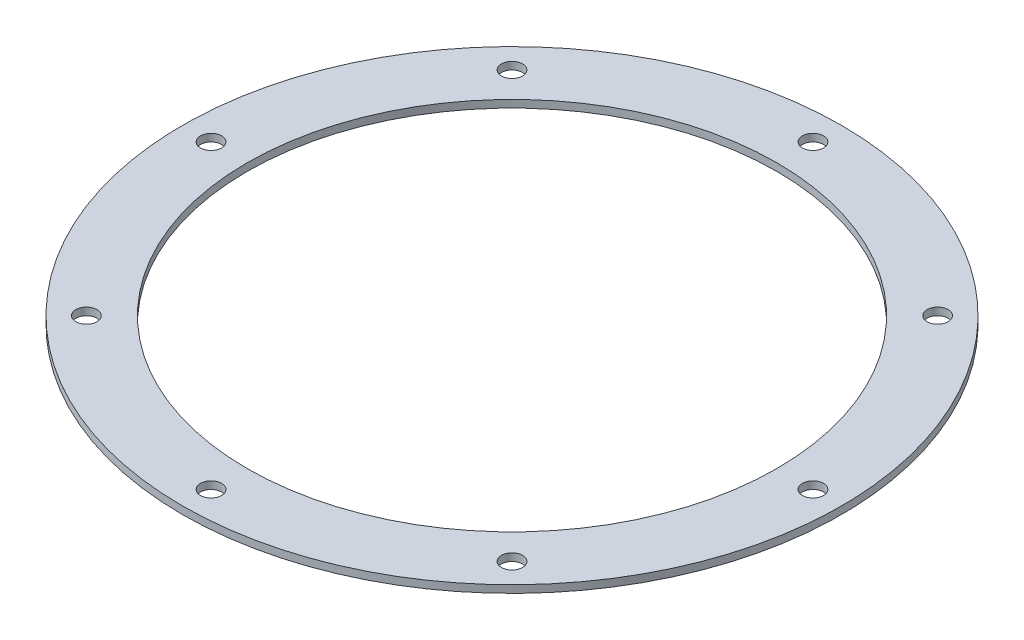
ISO-10303-21;
HEADER;
FILE_DESCRIPTION(('STEP AP214'),'2;1');
FILE_NAME('part.step','',(''),(''),'','','');
FILE_SCHEMA(('AUTOMOTIVE_DESIGN { 1 0 10303 214 1 1 1 1 }'));
ENDSEC;
DATA;
#1=APPLICATION_CONTEXT('core data for automotive mechanical design processes');
#2=APPLICATION_PROTOCOL_DEFINITION('international standard','automotive_design',2000,#1);
#3=PRODUCT_CONTEXT('',#1,'mechanical');
#4=PRODUCT('Part','Part','',(#3));
#5=PRODUCT_RELATED_PRODUCT_CATEGORY('part','',(#4));
#6=PRODUCT_DEFINITION_FORMATION('','',#4);
#7=PRODUCT_DEFINITION_CONTEXT('part definition',#1,'design');
#8=PRODUCT_DEFINITION('design','',#6,#7);
#9=PRODUCT_DEFINITION_SHAPE('','',#8);
#10=(LENGTH_UNIT() NAMED_UNIT(*) SI_UNIT(.MILLI.,.METRE.));
#11=(NAMED_UNIT(*) PLANE_ANGLE_UNIT() SI_UNIT($,.RADIAN.));
#12=(NAMED_UNIT(*) SI_UNIT($,.STERADIAN.) SOLID_ANGLE_UNIT());
#13=UNCERTAINTY_MEASURE_WITH_UNIT(LENGTH_MEASURE(1.E-05),#10,'distance_accuracy_value','');
#14=(GEOMETRIC_REPRESENTATION_CONTEXT(3) GLOBAL_UNCERTAINTY_ASSIGNED_CONTEXT((#13)) GLOBAL_UNIT_ASSIGNED_CONTEXT((#10,
#11,#12)) REPRESENTATION_CONTEXT('',''));
#15=CARTESIAN_POINT('',(0.,0.,0.));
#16=DIRECTION('',(0.,0.,1.));
#17=DIRECTION('',(1.,0.,0.));
#18=AXIS2_PLACEMENT_3D('',#15,#16,#17);
#19=CARTESIAN_POINT('',(0.,2.5,0.));
#20=DIRECTION('',(0.,1.,0.));
#21=DIRECTION('',(0.,0.,1.));
#22=AXIS2_PLACEMENT_3D('',#19,#20,#21);
#23=PLANE('',#22);
#24=CARTESIAN_POINT('',(-199.999999999994,2.5,5.67209541808933E-12));
#25=DIRECTION('',(0.,1.,0.));
#26=DIRECTION('',(0.,0.,1.));
#27=AXIS2_PLACEMENT_3D('',#24,#25,#26);
#28=CIRCLE('',#27,7.00000000000906);
#29=CARTESIAN_POINT('',(-199.999999999994,2.5,7.00000000001474));
#30=VERTEX_POINT('',#29);
#31=EDGE_CURVE('E86',#30,#30,#28,.T.);
#32=ORIENTED_EDGE('',*,*,#31,.F.);
#33=EDGE_LOOP('',(#32));
#34=FACE_BOUND('',#33,.T.);
#35=CARTESIAN_POINT('',(1.12952049642128E-11,2.5,200.));
#36=DIRECTION('',(0.,1.,0.));
#37=DIRECTION('',(0.,0.,1.));
#38=AXIS2_PLACEMENT_3D('',#35,#36,#37);
#39=CIRCLE('',#38,7.00000000001214);
#40=CARTESIAN_POINT('',(1.12952049642128E-11,2.5,207.000000000012));
#41=VERTEX_POINT('',#40);
#42=EDGE_CURVE('E74',#41,#41,#39,.T.);
#43=ORIENTED_EDGE('',*,*,#42,.F.);
#44=EDGE_LOOP('',(#43));
#45=FACE_BOUND('',#44,.T.);
#46=CARTESIAN_POINT('',(200.000000000006,2.5,-5.64760248210638E-12));
#47=DIRECTION('',(0.,1.,0.));
#48=DIRECTION('',(0.,0.,1.));
#49=AXIS2_PLACEMENT_3D('',#46,#47,#48);
#50=CIRCLE('',#49,7.00000000000442);
#51=CARTESIAN_POINT('',(200.000000000006,2.5,6.99999999999877));
#52=VERTEX_POINT('',#51);
#53=EDGE_CURVE('E62',#52,#52,#50,.T.);
#54=ORIENTED_EDGE('',*,*,#53,.F.);
#55=EDGE_LOOP('',(#54));
#56=FACE_BOUND('',#55,.T.);
#57=CARTESIAN_POINT('',(0.,2.5,-200.));
#58=DIRECTION('',(0.,1.,0.));
#59=DIRECTION('',(0.,0.,1.));
#60=AXIS2_PLACEMENT_3D('',#57,#58,#59);
#61=CIRCLE('',#60,7.);
#62=CARTESIAN_POINT('',(0.,2.5,-193.));
#63=VERTEX_POINT('',#62);
#64=EDGE_CURVE('E50',#63,#63,#61,.T.);
#65=ORIENTED_EDGE('',*,*,#64,.F.);
#66=EDGE_LOOP('',(#65));
#67=FACE_BOUND('',#66,.T.);
#68=CARTESIAN_POINT('',(0.,2.5,0.));
#69=DIRECTION('',(0.,1.,0.));
#70=DIRECTION('',(0.,0.,1.));
#71=AXIS2_PLACEMENT_3D('',#68,#69,#70);
#72=CIRCLE('',#71,219.);
#73=CARTESIAN_POINT('',(0.,2.5,219.));
#74=VERTEX_POINT('',#73);
#75=EDGE_CURVE('E10',#74,#74,#72,.T.);
#76=ORIENTED_EDGE('',*,*,#75,.T.);
#77=EDGE_LOOP('',(#76));
#78=FACE_BOUND('',#77,.T.);
#79=CARTESIAN_POINT('',(0.,2.5,0.));
#80=DIRECTION('',(0.,1.,0.));
#81=DIRECTION('',(0.,0.,1.));
#82=AXIS2_PLACEMENT_3D('',#79,#80,#81);
#83=CIRCLE('',#82,176.);
#84=CARTESIAN_POINT('',(0.,2.5,176.));
#85=VERTEX_POINT('',#84);
#86=EDGE_CURVE('E45',#85,#85,#83,.T.);
#87=ORIENTED_EDGE('',*,*,#86,.F.);
#88=EDGE_LOOP('',(#87));
#89=FACE_BOUND('',#88,.T.);
#90=CARTESIAN_POINT('',(141.42135623731,2.5,-141.421356237309));
#91=DIRECTION('',(0.,1.,0.));
#92=DIRECTION('',(0.,0.,1.));
#93=AXIS2_PLACEMENT_3D('',#90,#91,#92);
#94=CIRCLE('',#93,7.);
#95=CARTESIAN_POINT('',(141.42135623731,2.5,-134.421356237309));
#96=VERTEX_POINT('',#95);
#97=EDGE_CURVE('E56',#96,#96,#94,.T.);
#98=ORIENTED_EDGE('',*,*,#97,.F.);
#99=EDGE_LOOP('',(#98));
#100=FACE_BOUND('',#99,.T.);
#101=CARTESIAN_POINT('',(141.421356237319,2.5,141.421356237306));
#102=DIRECTION('',(0.,1.,0.));
#103=DIRECTION('',(0.,0.,1.));
#104=AXIS2_PLACEMENT_3D('',#101,#102,#103);
#105=CIRCLE('',#104,7.00000000000909);
#106=CARTESIAN_POINT('',(141.421356237319,2.5,148.421356237315));
#107=VERTEX_POINT('',#106);
#108=EDGE_CURVE('E68',#107,#107,#105,.T.);
#109=ORIENTED_EDGE('',*,*,#108,.F.);
#110=EDGE_LOOP('',(#109));
#111=FACE_BOUND('',#110,.T.);
#112=CARTESIAN_POINT('',(-141.4213562373,2.5,141.421356237314));
#113=DIRECTION('',(0.,1.,0.));
#114=DIRECTION('',(0.,0.,1.));
#115=AXIS2_PLACEMENT_3D('',#112,#113,#114);
#116=CIRCLE('',#115,7.00000000001208);
#117=CARTESIAN_POINT('',(-141.4213562373,2.5,148.421356237326));
#118=VERTEX_POINT('',#117);
#119=EDGE_CURVE('E80',#118,#118,#116,.T.);
#120=ORIENTED_EDGE('',*,*,#119,.F.);
#121=EDGE_LOOP('',(#120));
#122=FACE_BOUND('',#121,.T.);
#123=CARTESIAN_POINT('',(-141.421356237308,2.5,-141.421356237305));
#124=DIRECTION('',(0.,1.,0.));
#125=DIRECTION('',(0.,0.,1.));
#126=AXIS2_PLACEMENT_3D('',#123,#124,#125);
#127=CIRCLE('',#126,7.0000000000051);
#128=CARTESIAN_POINT('',(-141.421356237308,2.5,-134.4213562373));
#129=VERTEX_POINT('',#128);
#130=EDGE_CURVE('E92',#129,#129,#127,.T.);
#131=ORIENTED_EDGE('',*,*,#130,.F.);
#132=EDGE_LOOP('',(#131));
#133=FACE_BOUND('',#132,.T.);
#134=ADVANCED_FACE('F34',(#34,#45,#56,#67,#78,#89,#100,#111,#122,#133),#23,.T.);
#135=CARTESIAN_POINT('',(0.,-2.5,0.));
#136=DIRECTION('',(0.,1.,0.));
#137=DIRECTION('',(0.,0.,1.));
#138=AXIS2_PLACEMENT_3D('',#135,#136,#137);
#139=PLANE('',#138);
#140=CARTESIAN_POINT('',(0.,-2.5,0.));
#141=DIRECTION('',(0.,1.,0.));
#142=DIRECTION('',(0.,0.,1.));
#143=AXIS2_PLACEMENT_3D('',#140,#141,#142);
#144=CIRCLE('',#143,219.);
#145=CARTESIAN_POINT('',(0.,-2.5,219.));
#146=VERTEX_POINT('',#145);
#147=EDGE_CURVE('E38',#146,#146,#144,.T.);
#148=ORIENTED_EDGE('',*,*,#147,.F.);
#149=EDGE_LOOP('',(#148));
#150=FACE_BOUND('',#149,.T.);
#151=CARTESIAN_POINT('',(0.,-2.5,0.));
#152=DIRECTION('',(0.,1.,0.));
#153=DIRECTION('',(0.,0.,1.));
#154=AXIS2_PLACEMENT_3D('',#151,#152,#153);
#155=CIRCLE('',#154,176.);
#156=CARTESIAN_POINT('',(0.,-2.5,176.));
#157=VERTEX_POINT('',#156);
#158=EDGE_CURVE('E47',#157,#157,#155,.T.);
#159=ORIENTED_EDGE('',*,*,#158,.T.);
#160=EDGE_LOOP('',(#159));
#161=FACE_BOUND('',#160,.T.);
#162=CARTESIAN_POINT('',(0.,-2.5,-200.));
#163=DIRECTION('',(0.,1.,0.));
#164=DIRECTION('',(0.,0.,1.));
#165=AXIS2_PLACEMENT_3D('',#162,#163,#164);
#166=CIRCLE('',#165,7.);
#167=CARTESIAN_POINT('',(0.,-2.5,-193.));
#168=VERTEX_POINT('',#167);
#169=EDGE_CURVE('E53',#168,#168,#166,.T.);
#170=ORIENTED_EDGE('',*,*,#169,.T.);
#171=EDGE_LOOP('',(#170));
#172=FACE_BOUND('',#171,.T.);
#173=CARTESIAN_POINT('',(141.42135623731,-2.5,-141.421356237309));
#174=DIRECTION('',(0.,1.,0.));
#175=DIRECTION('',(0.,0.,1.));
#176=AXIS2_PLACEMENT_3D('',#173,#174,#175);
#177=CIRCLE('',#176,7.);
#178=CARTESIAN_POINT('',(141.42135623731,-2.5,-134.421356237309));
#179=VERTEX_POINT('',#178);
#180=EDGE_CURVE('E59',#179,#179,#177,.T.);
#181=ORIENTED_EDGE('',*,*,#180,.T.);
#182=EDGE_LOOP('',(#181));
#183=FACE_BOUND('',#182,.T.);
#184=CARTESIAN_POINT('',(200.000000000006,-2.5,-5.64760248210638E-12));
#185=DIRECTION('',(0.,1.,0.));
#186=DIRECTION('',(0.,0.,1.));
#187=AXIS2_PLACEMENT_3D('',#184,#185,#186);
#188=CIRCLE('',#187,7.00000000000442);
#189=CARTESIAN_POINT('',(200.000000000006,-2.5,6.99999999999877));
#190=VERTEX_POINT('',#189);
#191=EDGE_CURVE('E65',#190,#190,#188,.T.);
#192=ORIENTED_EDGE('',*,*,#191,.T.);
#193=EDGE_LOOP('',(#192));
#194=FACE_BOUND('',#193,.T.);
#195=CARTESIAN_POINT('',(141.421356237319,-2.5,141.421356237306));
#196=DIRECTION('',(0.,1.,0.));
#197=DIRECTION('',(0.,0.,1.));
#198=AXIS2_PLACEMENT_3D('',#195,#196,#197);
#199=CIRCLE('',#198,7.00000000000909);
#200=CARTESIAN_POINT('',(141.421356237319,-2.5,148.421356237315));
#201=VERTEX_POINT('',#200);
#202=EDGE_CURVE('E71',#201,#201,#199,.T.);
#203=ORIENTED_EDGE('',*,*,#202,.T.);
#204=EDGE_LOOP('',(#203));
#205=FACE_BOUND('',#204,.T.);
#206=CARTESIAN_POINT('',(1.12952049642128E-11,-2.5,200.));
#207=DIRECTION('',(0.,1.,0.));
#208=DIRECTION('',(0.,0.,1.));
#209=AXIS2_PLACEMENT_3D('',#206,#207,#208);
#210=CIRCLE('',#209,7.00000000001214);
#211=CARTESIAN_POINT('',(1.12952049642128E-11,-2.5,207.000000000012));
#212=VERTEX_POINT('',#211);
#213=EDGE_CURVE('E77',#212,#212,#210,.T.);
#214=ORIENTED_EDGE('',*,*,#213,.T.);
#215=EDGE_LOOP('',(#214));
#216=FACE_BOUND('',#215,.T.);
#217=CARTESIAN_POINT('',(-141.4213562373,-2.5,141.421356237314));
#218=DIRECTION('',(0.,1.,0.));
#219=DIRECTION('',(0.,0.,1.));
#220=AXIS2_PLACEMENT_3D('',#217,#218,#219);
#221=CIRCLE('',#220,7.00000000001208);
#222=CARTESIAN_POINT('',(-141.4213562373,-2.5,148.421356237326));
#223=VERTEX_POINT('',#222);
#224=EDGE_CURVE('E83',#223,#223,#221,.T.);
#225=ORIENTED_EDGE('',*,*,#224,.T.);
#226=EDGE_LOOP('',(#225));
#227=FACE_BOUND('',#226,.T.);
#228=CARTESIAN_POINT('',(-199.999999999994,-2.5,5.67209541808933E-12));
#229=DIRECTION('',(0.,1.,0.));
#230=DIRECTION('',(0.,0.,1.));
#231=AXIS2_PLACEMENT_3D('',#228,#229,#230);
#232=CIRCLE('',#231,7.00000000000906);
#233=CARTESIAN_POINT('',(-199.999999999994,-2.5,7.00000000001474));
#234=VERTEX_POINT('',#233);
#235=EDGE_CURVE('E89',#234,#234,#232,.T.);
#236=ORIENTED_EDGE('',*,*,#235,.T.);
#237=EDGE_LOOP('',(#236));
#238=FACE_BOUND('',#237,.T.);
#239=CARTESIAN_POINT('',(-141.421356237308,-2.5,-141.421356237305));
#240=DIRECTION('',(0.,1.,0.));
#241=DIRECTION('',(0.,0.,1.));
#242=AXIS2_PLACEMENT_3D('',#239,#240,#241);
#243=CIRCLE('',#242,7.0000000000051);
#244=CARTESIAN_POINT('',(-141.421356237308,-2.5,-134.4213562373));
#245=VERTEX_POINT('',#244);
#246=EDGE_CURVE('E95',#245,#245,#243,.T.);
#247=ORIENTED_EDGE('',*,*,#246,.T.);
#248=EDGE_LOOP('',(#247));
#249=FACE_BOUND('',#248,.T.);
#250=ADVANCED_FACE('F105',(#150,#161,#172,#183,#194,#205,#216,#227,#238,#249),#139,.F.);
#251=CARTESIAN_POINT('',(0.,2.5,0.));
#252=DIRECTION('',(0.,-1.,0.));
#253=DIRECTION('',(0.,0.,-1.));
#254=AXIS2_PLACEMENT_3D('',#251,#252,#253);
#255=CYLINDRICAL_SURFACE('',#254,219.);
#256=ORIENTED_EDGE('',*,*,#75,.F.);
#257=EDGE_LOOP('',(#256));
#258=FACE_BOUND('',#257,.T.);
#259=ORIENTED_EDGE('',*,*,#147,.T.);
#260=EDGE_LOOP('',(#259));
#261=FACE_BOUND('',#260,.T.);
#262=ADVANCED_FACE('F36',(#258,#261),#255,.T.);
#263=CARTESIAN_POINT('',(0.,2.5,0.));
#264=DIRECTION('',(0.,-1.,0.));
#265=DIRECTION('',(0.,0.,-1.));
#266=AXIS2_PLACEMENT_3D('',#263,#264,#265);
#267=CYLINDRICAL_SURFACE('',#266,176.);
#268=ORIENTED_EDGE('',*,*,#86,.T.);
#269=EDGE_LOOP('',(#268));
#270=FACE_BOUND('',#269,.T.);
#271=ORIENTED_EDGE('',*,*,#158,.F.);
#272=EDGE_LOOP('',(#271));
#273=FACE_BOUND('',#272,.T.);
#274=ADVANCED_FACE('F115',(#270,#273),#267,.F.);
#275=CARTESIAN_POINT('',(0.,2.5,-200.));
#276=DIRECTION('',(0.,-1.,0.));
#277=DIRECTION('',(0.,0.,-1.));
#278=AXIS2_PLACEMENT_3D('',#275,#276,#277);
#279=CYLINDRICAL_SURFACE('',#278,7.);
#280=ORIENTED_EDGE('',*,*,#64,.T.);
#281=EDGE_LOOP('',(#280));
#282=FACE_BOUND('',#281,.T.);
#283=ORIENTED_EDGE('',*,*,#169,.F.);
#284=EDGE_LOOP('',(#283));
#285=FACE_BOUND('',#284,.T.);
#286=ADVANCED_FACE('F118',(#282,#285),#279,.F.);
#287=CARTESIAN_POINT('',(141.42135623731,2.5,-141.421356237309));
#288=DIRECTION('',(0.,-1.,0.));
#289=DIRECTION('',(0.,0.,-1.));
#290=AXIS2_PLACEMENT_3D('',#287,#288,#289);
#291=CYLINDRICAL_SURFACE('',#290,7.);
#292=ORIENTED_EDGE('',*,*,#97,.T.);
#293=EDGE_LOOP('',(#292));
#294=FACE_BOUND('',#293,.T.);
#295=ORIENTED_EDGE('',*,*,#180,.F.);
#296=EDGE_LOOP('',(#295));
#297=FACE_BOUND('',#296,.T.);
#298=ADVANCED_FACE('F122',(#294,#297),#291,.F.);
#299=CARTESIAN_POINT('',(200.000000000006,2.5,-5.64760248210638E-12));
#300=DIRECTION('',(0.,-1.,0.));
#301=DIRECTION('',(0.,0.,-1.));
#302=AXIS2_PLACEMENT_3D('',#299,#300,#301);
#303=CYLINDRICAL_SURFACE('',#302,7.00000000000442);
#304=ORIENTED_EDGE('',*,*,#53,.T.);
#305=EDGE_LOOP('',(#304));
#306=FACE_BOUND('',#305,.T.);
#307=ORIENTED_EDGE('',*,*,#191,.F.);
#308=EDGE_LOOP('',(#307));
#309=FACE_BOUND('',#308,.T.);
#310=ADVANCED_FACE('F126',(#306,#309),#303,.F.);
#311=CARTESIAN_POINT('',(141.421356237319,2.5,141.421356237306));
#312=DIRECTION('',(0.,-1.,0.));
#313=DIRECTION('',(0.,0.,-1.));
#314=AXIS2_PLACEMENT_3D('',#311,#312,#313);
#315=CYLINDRICAL_SURFACE('',#314,7.00000000000909);
#316=ORIENTED_EDGE('',*,*,#108,.T.);
#317=EDGE_LOOP('',(#316));
#318=FACE_BOUND('',#317,.T.);
#319=ORIENTED_EDGE('',*,*,#202,.F.);
#320=EDGE_LOOP('',(#319));
#321=FACE_BOUND('',#320,.T.);
#322=ADVANCED_FACE('F130',(#318,#321),#315,.F.);
#323=CARTESIAN_POINT('',(1.12952049642128E-11,2.5,200.));
#324=DIRECTION('',(0.,-1.,0.));
#325=DIRECTION('',(0.,0.,-1.));
#326=AXIS2_PLACEMENT_3D('',#323,#324,#325);
#327=CYLINDRICAL_SURFACE('',#326,7.00000000001214);
#328=ORIENTED_EDGE('',*,*,#42,.T.);
#329=EDGE_LOOP('',(#328));
#330=FACE_BOUND('',#329,.T.);
#331=ORIENTED_EDGE('',*,*,#213,.F.);
#332=EDGE_LOOP('',(#331));
#333=FACE_BOUND('',#332,.T.);
#334=ADVANCED_FACE('F134',(#330,#333),#327,.F.);
#335=CARTESIAN_POINT('',(-141.4213562373,2.5,141.421356237314));
#336=DIRECTION('',(0.,-1.,0.));
#337=DIRECTION('',(0.,0.,-1.));
#338=AXIS2_PLACEMENT_3D('',#335,#336,#337);
#339=CYLINDRICAL_SURFACE('',#338,7.00000000001208);
#340=ORIENTED_EDGE('',*,*,#119,.T.);
#341=EDGE_LOOP('',(#340));
#342=FACE_BOUND('',#341,.T.);
#343=ORIENTED_EDGE('',*,*,#224,.F.);
#344=EDGE_LOOP('',(#343));
#345=FACE_BOUND('',#344,.T.);
#346=ADVANCED_FACE('F138',(#342,#345),#339,.F.);
#347=CARTESIAN_POINT('',(-199.999999999994,2.5,5.67209541808933E-12));
#348=DIRECTION('',(0.,-1.,0.));
#349=DIRECTION('',(0.,0.,-1.));
#350=AXIS2_PLACEMENT_3D('',#347,#348,#349);
#351=CYLINDRICAL_SURFACE('',#350,7.00000000000906);
#352=ORIENTED_EDGE('',*,*,#31,.T.);
#353=EDGE_LOOP('',(#352));
#354=FACE_BOUND('',#353,.T.);
#355=ORIENTED_EDGE('',*,*,#235,.F.);
#356=EDGE_LOOP('',(#355));
#357=FACE_BOUND('',#356,.T.);
#358=ADVANCED_FACE('F142',(#354,#357),#351,.F.);
#359=CARTESIAN_POINT('',(-141.421356237308,2.5,-141.421356237305));
#360=DIRECTION('',(0.,-1.,0.));
#361=DIRECTION('',(0.,0.,-1.));
#362=AXIS2_PLACEMENT_3D('',#359,#360,#361);
#363=CYLINDRICAL_SURFACE('',#362,7.0000000000051);
#364=ORIENTED_EDGE('',*,*,#130,.T.);
#365=EDGE_LOOP('',(#364));
#366=FACE_BOUND('',#365,.T.);
#367=ORIENTED_EDGE('',*,*,#246,.F.);
#368=EDGE_LOOP('',(#367));
#369=FACE_BOUND('',#368,.T.);
#370=ADVANCED_FACE('F101',(#366,#369),#363,.F.);
#371=CLOSED_SHELL('',(#134,#250,#262,#274,#286,#298,#310,#322,#334,#346,#358,#370));
#372=MANIFOLD_SOLID_BREP('B2',#371);
#373=ADVANCED_BREP_SHAPE_REPRESENTATION('',(#18,#372),#14);
#374=SHAPE_DEFINITION_REPRESENTATION(#9,#373);
ENDSEC;
END-ISO-10303-21;
